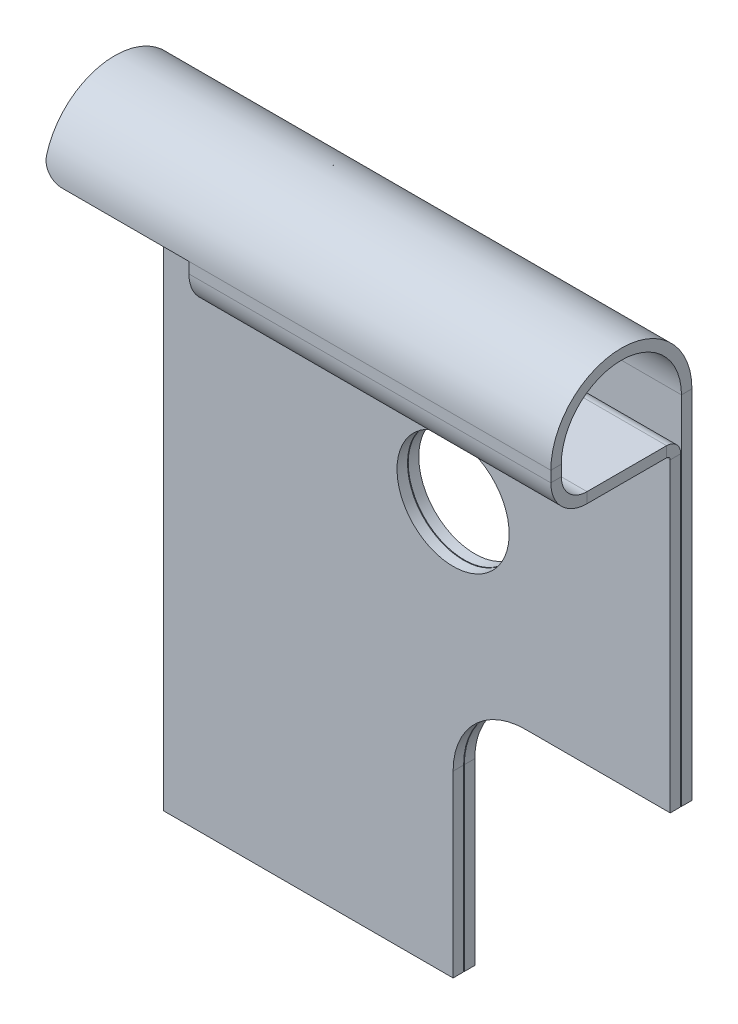
ISO-10303-21;
HEADER;
FILE_DESCRIPTION(('STEP AP214'),'2;1');
FILE_NAME('part.step','',(''),(''),'','','');
FILE_SCHEMA(('AUTOMOTIVE_DESIGN { 1 0 10303 214 1 1 1 1 }'));
ENDSEC;
DATA;
#1=APPLICATION_CONTEXT('core data for automotive mechanical design processes');
#2=APPLICATION_PROTOCOL_DEFINITION('international standard','automotive_design',2000,#1);
#3=PRODUCT_CONTEXT('',#1,'mechanical');
#4=PRODUCT('Part','Part','',(#3));
#5=PRODUCT_RELATED_PRODUCT_CATEGORY('part','',(#4));
#6=PRODUCT_DEFINITION_FORMATION('','',#4);
#7=PRODUCT_DEFINITION_CONTEXT('part definition',#1,'design');
#8=PRODUCT_DEFINITION('design','',#6,#7);
#9=PRODUCT_DEFINITION_SHAPE('','',#8);
#10=(LENGTH_UNIT() NAMED_UNIT(*) SI_UNIT(.MILLI.,.METRE.));
#11=(NAMED_UNIT(*) PLANE_ANGLE_UNIT() SI_UNIT($,.RADIAN.));
#12=(NAMED_UNIT(*) SI_UNIT($,.STERADIAN.) SOLID_ANGLE_UNIT());
#13=UNCERTAINTY_MEASURE_WITH_UNIT(LENGTH_MEASURE(1.E-05),#10,'distance_accuracy_value','');
#14=(GEOMETRIC_REPRESENTATION_CONTEXT(3) GLOBAL_UNCERTAINTY_ASSIGNED_CONTEXT((#13)) GLOBAL_UNIT_ASSIGNED_CONTEXT((#10,
#11,#12)) REPRESENTATION_CONTEXT('',''));
#15=CARTESIAN_POINT('',(0.,0.,0.));
#16=DIRECTION('',(0.,0.,1.));
#17=DIRECTION('',(1.,0.,0.));
#18=AXIS2_PLACEMENT_3D('',#15,#16,#17);
#19=CARTESIAN_POINT('',(14.,-1.4,-1.25));
#20=DIRECTION('',(-1.,0.,0.));
#21=DIRECTION('',(0.,0.,-1.));
#22=AXIS2_PLACEMENT_3D('',#19,#20,#21);
#23=CYLINDRICAL_SURFACE('',#22,0.39);
#24=CARTESIAN_POINT('',(4.,-1.4,-1.25));
#25=DIRECTION('',(-1.,0.,0.));
#26=DIRECTION('',(0.,0.,1.));
#27=AXIS2_PLACEMENT_3D('',#24,#25,#26);
#28=CIRCLE('',#27,0.39);
#29=CARTESIAN_POINT('',(4.,-1.4,-1.64));
#30=VERTEX_POINT('',#29);
#31=CARTESIAN_POINT('',(4.,-1.01,-1.25));
#32=VERTEX_POINT('',#31);
#33=EDGE_CURVE('E269',#30,#32,#28,.F.);
#34=ORIENTED_EDGE('',*,*,#33,.T.);
#35=DIRECTION('',(-1.,0.,0.));
#36=VECTOR('',#35,1.);
#37=CARTESIAN_POINT('',(14.,-1.01,-1.25));
#38=LINE('',#37,#36);
#39=CARTESIAN_POINT('',(14.,-1.01,-1.25));
#40=VERTEX_POINT('',#39);
#41=EDGE_CURVE('E346',#40,#32,#38,.T.);
#42=ORIENTED_EDGE('',*,*,#41,.F.);
#43=CARTESIAN_POINT('',(14.,-1.4,-1.25));
#44=DIRECTION('',(-1.,0.,0.));
#45=DIRECTION('',(0.,0.,1.));
#46=AXIS2_PLACEMENT_3D('',#43,#44,#45);
#47=CIRCLE('',#46,0.39);
#48=CARTESIAN_POINT('',(14.,-1.4,-1.64));
#49=VERTEX_POINT('',#48);
#50=EDGE_CURVE('E370',#49,#40,#47,.F.);
#51=ORIENTED_EDGE('',*,*,#50,.F.);
#52=DIRECTION('',(-1.,0.,0.));
#53=VECTOR('',#52,1.);
#54=CARTESIAN_POINT('',(14.,-1.4,-1.64));
#55=LINE('',#54,#53);
#56=EDGE_CURVE('E367',#49,#30,#55,.T.);
#57=ORIENTED_EDGE('',*,*,#56,.T.);
#58=EDGE_LOOP('',(#34,#42,#51,#57));
#59=FACE_BOUND('',#58,.T.);
#60=ADVANCED_FACE('F39',(#59),#23,.T.);
#61=CARTESIAN_POINT('',(14.,-1.4,-1.25));
#62=DIRECTION('',(-1.,0.,0.));
#63=DIRECTION('',(0.,0.,-1.));
#64=AXIS2_PLACEMENT_3D('',#61,#62,#63);
#65=CYLINDRICAL_SURFACE('',#64,0.1);
#66=DIRECTION('',(1.,0.,0.));
#67=VECTOR('',#66,1.);
#68=CARTESIAN_POINT('',(14.,-1.4,-1.35));
#69=LINE('',#68,#67);
#70=CARTESIAN_POINT('',(14.,-1.4,-1.35));
#71=VERTEX_POINT('',#70);
#72=CARTESIAN_POINT('',(4.,-1.4,-1.35));
#73=VERTEX_POINT('',#72);
#74=EDGE_CURVE('E374',#71,#73,#69,.F.);
#75=ORIENTED_EDGE('',*,*,#74,.F.);
#76=CARTESIAN_POINT('',(14.,-1.4,-1.25));
#77=DIRECTION('',(1.,0.,0.));
#78=DIRECTION('',(0.,0.,-1.));
#79=AXIS2_PLACEMENT_3D('',#76,#77,#78);
#80=CIRCLE('',#79,0.1);
#81=CARTESIAN_POINT('',(14.,-1.3,-1.25));
#82=VERTEX_POINT('',#81);
#83=EDGE_CURVE('E324',#71,#82,#80,.T.);
#84=ORIENTED_EDGE('',*,*,#83,.T.);
#85=DIRECTION('',(-1.,0.,0.));
#86=VECTOR('',#85,1.);
#87=CARTESIAN_POINT('',(14.,-1.3,-1.25));
#88=LINE('',#87,#86);
#89=CARTESIAN_POINT('',(4.,-1.3,-1.25));
#90=VERTEX_POINT('',#89);
#91=EDGE_CURVE('E378',#82,#90,#88,.T.);
#92=ORIENTED_EDGE('',*,*,#91,.T.);
#93=CARTESIAN_POINT('',(4.,-1.4,-1.25));
#94=DIRECTION('',(1.,0.,0.));
#95=DIRECTION('',(0.,0.,-1.));
#96=AXIS2_PLACEMENT_3D('',#93,#94,#95);
#97=CIRCLE('',#96,0.1);
#98=EDGE_CURVE('E270',#73,#90,#97,.T.);
#99=ORIENTED_EDGE('',*,*,#98,.F.);
#100=EDGE_LOOP('',(#75,#84,#92,#99));
#101=FACE_BOUND('',#100,.T.);
#102=ADVANCED_FACE('F471',(#101),#65,.F.);
#103=CARTESIAN_POINT('',(14.,-0.3,0.950000000000001));
#104=DIRECTION('',(-1.,0.,0.));
#105=DIRECTION('',(0.,0.,-1.));
#106=AXIS2_PLACEMENT_3D('',#103,#104,#105);
#107=CYLINDRICAL_SURFACE('',#106,0.71);
#108=DIRECTION('',(-1.,0.,0.));
#109=VECTOR('',#108,1.);
#110=CARTESIAN_POINT('',(14.,-0.3,1.66));
#111=LINE('',#110,#109);
#112=CARTESIAN_POINT('',(14.,-0.3,1.66));
#113=VERTEX_POINT('',#112);
#114=CARTESIAN_POINT('',(4.,-0.3,1.66));
#115=VERTEX_POINT('',#114);
#116=EDGE_CURVE('E320',#113,#115,#111,.T.);
#117=ORIENTED_EDGE('',*,*,#116,.F.);
#118=CARTESIAN_POINT('',(14.,-0.3,0.950000000000001));
#119=DIRECTION('',(-1.,0.,0.));
#120=DIRECTION('',(0.,0.,1.));
#121=AXIS2_PLACEMENT_3D('',#118,#119,#120);
#122=CIRCLE('',#121,0.71);
#123=CARTESIAN_POINT('',(14.,-1.01,0.950000000000001));
#124=VERTEX_POINT('',#123);
#125=EDGE_CURVE('E355',#124,#113,#122,.T.);
#126=ORIENTED_EDGE('',*,*,#125,.F.);
#127=DIRECTION('',(-1.,0.,0.));
#128=VECTOR('',#127,1.);
#129=CARTESIAN_POINT('',(14.,-1.01,0.950000000000001));
#130=LINE('',#129,#128);
#131=CARTESIAN_POINT('',(4.,-1.01,0.95));
#132=VERTEX_POINT('',#131);
#133=EDGE_CURVE('E352',#124,#132,#130,.T.);
#134=ORIENTED_EDGE('',*,*,#133,.T.);
#135=CARTESIAN_POINT('',(4.,-0.3,0.950000000000001));
#136=DIRECTION('',(1.,0.,0.));
#137=DIRECTION('',(0.,0.,-1.));
#138=AXIS2_PLACEMENT_3D('',#135,#136,#137);
#139=CIRCLE('',#138,0.71);
#140=EDGE_CURVE('E276',#132,#115,#139,.F.);
#141=ORIENTED_EDGE('',*,*,#140,.T.);
#142=EDGE_LOOP('',(#117,#126,#134,#141));
#143=FACE_BOUND('',#142,.T.);
#144=ADVANCED_FACE('F467',(#143),#107,.F.);
#145=CARTESIAN_POINT('',(14.,-1.01,-1.25));
#146=DIRECTION('',(0.,1.,0.));
#147=DIRECTION('',(0.,0.,-1.));
#148=AXIS2_PLACEMENT_3D('',#145,#146,#147);
#149=PLANE('',#148);
#150=ORIENTED_EDGE('',*,*,#133,.F.);
#151=DIRECTION('',(0.,0.,1.));
#152=VECTOR('',#151,1.);
#153=CARTESIAN_POINT('',(14.,-1.01,-1.25));
#154=LINE('',#153,#152);
#155=EDGE_CURVE('E349',#40,#124,#154,.T.);
#156=ORIENTED_EDGE('',*,*,#155,.F.);
#157=ORIENTED_EDGE('',*,*,#41,.T.);
#158=DIRECTION('',(0.,0.,-1.));
#159=VECTOR('',#158,1.);
#160=CARTESIAN_POINT('',(4.,-1.01,-1.25));
#161=LINE('',#160,#159);
#162=EDGE_CURVE('E298',#132,#32,#161,.T.);
#163=ORIENTED_EDGE('',*,*,#162,.F.);
#164=EDGE_LOOP('',(#150,#156,#157,#163));
#165=FACE_BOUND('',#164,.T.);
#166=ADVANCED_FACE('F463',(#165),#149,.T.);
#167=CARTESIAN_POINT('',(14.,0.,1.66));
#168=DIRECTION('',(0.,0.,-1.));
#169=DIRECTION('',(0.,-1.,0.));
#170=AXIS2_PLACEMENT_3D('',#167,#168,#169);
#171=PLANE('',#170);
#172=DIRECTION('',(-1.,0.,0.));
#173=VECTOR('',#172,1.);
#174=CARTESIAN_POINT('',(14.,0.,1.66));
#175=LINE('',#174,#173);
#176=CARTESIAN_POINT('',(14.,0.,1.66));
#177=VERTEX_POINT('',#176);
#178=CARTESIAN_POINT('',(4.,0.,1.66));
#179=VERTEX_POINT('',#178);
#180=EDGE_CURVE('E327',#177,#179,#175,.T.);
#181=ORIENTED_EDGE('',*,*,#180,.F.);
#182=DIRECTION('',(0.,1.,0.));
#183=VECTOR('',#182,1.);
#184=CARTESIAN_POINT('',(14.,0.,1.66));
#185=LINE('',#184,#183);
#186=EDGE_CURVE('E323',#113,#177,#185,.T.);
#187=ORIENTED_EDGE('',*,*,#186,.F.);
#188=ORIENTED_EDGE('',*,*,#116,.T.);
#189=DIRECTION('',(0.,-1.,0.));
#190=VECTOR('',#189,1.);
#191=CARTESIAN_POINT('',(4.,0.,1.66));
#192=LINE('',#191,#190);
#193=EDGE_CURVE('E282',#179,#115,#192,.T.);
#194=ORIENTED_EDGE('',*,*,#193,.F.);
#195=EDGE_LOOP('',(#181,#187,#188,#194));
#196=FACE_BOUND('',#195,.T.);
#197=ADVANCED_FACE('F466',(#196),#171,.T.);
#198=CARTESIAN_POINT('',(14.,-0.3,0.950000000000001));
#199=DIRECTION('',(-1.,0.,0.));
#200=DIRECTION('',(0.,0.,-1.));
#201=AXIS2_PLACEMENT_3D('',#198,#199,#200);
#202=CYLINDRICAL_SURFACE('',#201,1.);
#203=CARTESIAN_POINT('',(4.,-0.3,0.950000000000001));
#204=DIRECTION('',(-1.,0.,0.));
#205=DIRECTION('',(0.,0.,1.));
#206=AXIS2_PLACEMENT_3D('',#203,#204,#205);
#207=CIRCLE('',#206,1.);
#208=CARTESIAN_POINT('',(4.,-1.3,0.95));
#209=VERTEX_POINT('',#208);
#210=CARTESIAN_POINT('',(4.,-0.3,1.95));
#211=VERTEX_POINT('',#210);
#212=EDGE_CURVE('E273',#209,#211,#207,.T.);
#213=ORIENTED_EDGE('',*,*,#212,.F.);
#214=DIRECTION('',(1.,0.,0.));
#215=VECTOR('',#214,1.);
#216=CARTESIAN_POINT('',(14.,-1.3,0.950000000000001));
#217=LINE('',#216,#215);
#218=CARTESIAN_POINT('',(14.,-1.3,0.950000000000001));
#219=VERTEX_POINT('',#218);
#220=EDGE_CURVE('E383',#219,#209,#217,.F.);
#221=ORIENTED_EDGE('',*,*,#220,.F.);
#222=CARTESIAN_POINT('',(14.,-0.3,0.950000000000001));
#223=DIRECTION('',(1.,0.,0.));
#224=DIRECTION('',(0.,0.,-1.));
#225=AXIS2_PLACEMENT_3D('',#222,#223,#224);
#226=CIRCLE('',#225,1.);
#227=CARTESIAN_POINT('',(14.,-0.3,1.95));
#228=VERTEX_POINT('',#227);
#229=EDGE_CURVE('E386',#219,#228,#226,.F.);
#230=ORIENTED_EDGE('',*,*,#229,.T.);
#231=DIRECTION('',(-1.,0.,0.));
#232=VECTOR('',#231,1.);
#233=CARTESIAN_POINT('',(14.,-0.3,1.95));
#234=LINE('',#233,#232);
#235=EDGE_CURVE('E319',#228,#211,#234,.T.);
#236=ORIENTED_EDGE('',*,*,#235,.T.);
#237=EDGE_LOOP('',(#213,#221,#230,#236));
#238=FACE_BOUND('',#237,.T.);
#239=ADVANCED_FACE('F488',(#238),#202,.T.);
#240=CARTESIAN_POINT('',(14.,-1.3,-1.25));
#241=DIRECTION('',(0.,1.,0.));
#242=DIRECTION('',(0.,0.,-1.));
#243=AXIS2_PLACEMENT_3D('',#240,#241,#242);
#244=PLANE('',#243);
#245=DIRECTION('',(0.,0.,-1.));
#246=VECTOR('',#245,1.);
#247=CARTESIAN_POINT('',(4.,-1.3,-1.35));
#248=LINE('',#247,#246);
#249=EDGE_CURVE('E296',#209,#90,#248,.T.);
#250=ORIENTED_EDGE('',*,*,#249,.T.);
#251=ORIENTED_EDGE('',*,*,#91,.F.);
#252=DIRECTION('',(0.,0.,-1.));
#253=VECTOR('',#252,1.);
#254=CARTESIAN_POINT('',(14.,-1.3,-1.25));
#255=LINE('',#254,#253);
#256=EDGE_CURVE('E381',#82,#219,#255,.F.);
#257=ORIENTED_EDGE('',*,*,#256,.T.);
#258=ORIENTED_EDGE('',*,*,#220,.T.);
#259=EDGE_LOOP('',(#250,#251,#257,#258));
#260=FACE_BOUND('',#259,.T.);
#261=ADVANCED_FACE('F491',(#260),#244,.F.);
#262=CARTESIAN_POINT('',(14.,0.,1.95));
#263=DIRECTION('',(0.,0.,-1.));
#264=DIRECTION('',(0.,-1.,0.));
#265=AXIS2_PLACEMENT_3D('',#262,#263,#264);
#266=PLANE('',#265);
#267=DIRECTION('',(0.,-1.,0.));
#268=VECTOR('',#267,1.);
#269=CARTESIAN_POINT('',(4.,0.,1.95));
#270=LINE('',#269,#268);
#271=CARTESIAN_POINT('',(4.,0.,1.95));
#272=VERTEX_POINT('',#271);
#273=EDGE_CURVE('E279',#272,#211,#270,.T.);
#274=ORIENTED_EDGE('',*,*,#273,.T.);
#275=ORIENTED_EDGE('',*,*,#235,.F.);
#276=DIRECTION('',(0.,-1.,0.));
#277=VECTOR('',#276,1.);
#278=CARTESIAN_POINT('',(14.,0.,1.95));
#279=LINE('',#278,#277);
#280=CARTESIAN_POINT('',(14.,0.,1.95));
#281=VERTEX_POINT('',#280);
#282=EDGE_CURVE('E389',#228,#281,#279,.F.);
#283=ORIENTED_EDGE('',*,*,#282,.T.);
#284=DIRECTION('',(1.,0.,0.));
#285=VECTOR('',#284,1.);
#286=CARTESIAN_POINT('',(14.,0.,1.95));
#287=LINE('',#286,#285);
#288=EDGE_CURVE('E390',#281,#272,#287,.F.);
#289=ORIENTED_EDGE('',*,*,#288,.T.);
#290=EDGE_LOOP('',(#274,#275,#283,#289));
#291=FACE_BOUND('',#290,.T.);
#292=ADVANCED_FACE('F494',(#291),#266,.F.);
#293=CARTESIAN_POINT('',(14.,-16.8,-1.64));
#294=DIRECTION('',(0.,1.,0.));
#295=DIRECTION('',(-1.,0.,0.));
#296=AXIS2_PLACEMENT_3D('',#293,#294,#295);
#297=PLANE('',#296);
#298=DIRECTION('',(0.,0.,-1.));
#299=VECTOR('',#298,1.);
#300=CARTESIAN_POINT('',(8.,-16.8,1.95));
#301=LINE('',#300,#299);
#302=CARTESIAN_POINT('',(8.,-16.8,-1.35));
#303=VERTEX_POINT('',#302);
#304=CARTESIAN_POINT('',(8.,-16.8,-1.64));
#305=VERTEX_POINT('',#304);
#306=EDGE_CURVE('E239',#303,#305,#301,.T.);
#307=ORIENTED_EDGE('',*,*,#306,.F.);
#308=DIRECTION('',(1.,0.,0.));
#309=VECTOR('',#308,1.);
#310=CARTESIAN_POINT('',(14.,-16.8,-1.35));
#311=LINE('',#310,#309);
#312=CARTESIAN_POINT('',(0.,-16.8,-1.35));
#313=VERTEX_POINT('',#312);
#314=EDGE_CURVE('E415',#303,#313,#311,.F.);
#315=ORIENTED_EDGE('',*,*,#314,.T.);
#316=DIRECTION('',(0.,0.,-1.));
#317=VECTOR('',#316,1.);
#318=CARTESIAN_POINT('',(0.,-16.8,-1.64));
#319=LINE('',#318,#317);
#320=CARTESIAN_POINT('',(0.,-16.8,-1.64));
#321=VERTEX_POINT('',#320);
#322=EDGE_CURVE('E440',#313,#321,#319,.T.);
#323=ORIENTED_EDGE('',*,*,#322,.T.);
#324=DIRECTION('',(-1.,0.,0.));
#325=VECTOR('',#324,1.);
#326=CARTESIAN_POINT('',(14.,-16.8,-1.64));
#327=LINE('',#326,#325);
#328=EDGE_CURVE('E361',#305,#321,#327,.T.);
#329=ORIENTED_EDGE('',*,*,#328,.F.);
#330=EDGE_LOOP('',(#307,#315,#323,#329));
#331=FACE_BOUND('',#330,.T.);
#332=ADVANCED_FACE('F506',(#331),#297,.F.);
#333=CARTESIAN_POINT('',(14.,-16.8,-1.64));
#334=DIRECTION('',(1.,0.,0.));
#335=DIRECTION('',(0.,1.,0.));
#336=AXIS2_PLACEMENT_3D('',#333,#334,#335);
#337=PLANE('',#336);
#338=DIRECTION('',(0.,0.,-1.));
#339=VECTOR('',#338,1.);
#340=CARTESIAN_POINT('',(14.,-9.84999999999999,1.95));
#341=LINE('',#340,#339);
#342=CARTESIAN_POINT('',(14.,-9.84999999999999,-1.35));
#343=VERTEX_POINT('',#342);
#344=CARTESIAN_POINT('',(14.,-9.84999999999999,-1.64));
#345=VERTEX_POINT('',#344);
#346=EDGE_CURVE('E217',#343,#345,#341,.T.);
#347=ORIENTED_EDGE('',*,*,#346,.T.);
#348=DIRECTION('',(0.,1.,0.));
#349=VECTOR('',#348,1.);
#350=CARTESIAN_POINT('',(14.,-16.8,-1.64));
#351=LINE('',#350,#349);
#352=EDGE_CURVE('E364',#345,#49,#351,.T.);
#353=ORIENTED_EDGE('',*,*,#352,.T.);
#354=DIRECTION('',(0.,0.,-1.));
#355=VECTOR('',#354,1.);
#356=CARTESIAN_POINT('',(14.,-1.4,-1.64));
#357=LINE('',#356,#355);
#358=EDGE_CURVE('E438',#71,#49,#357,.T.);
#359=ORIENTED_EDGE('',*,*,#358,.F.);
#360=DIRECTION('',(0.,-1.,0.));
#361=VECTOR('',#360,1.);
#362=CARTESIAN_POINT('',(14.,-16.8,-1.35));
#363=LINE('',#362,#361);
#364=EDGE_CURVE('E377',#343,#71,#363,.F.);
#365=ORIENTED_EDGE('',*,*,#364,.F.);
#366=EDGE_LOOP('',(#347,#353,#359,#365));
#367=FACE_BOUND('',#366,.T.);
#368=ADVANCED_FACE('F543',(#367),#337,.T.);
#369=CARTESIAN_POINT('',(14.,-1.4,-1.25));
#370=DIRECTION('',(-1.,0.,0.));
#371=DIRECTION('',(0.,0.,-1.));
#372=AXIS2_PLACEMENT_3D('',#369,#370,#371);
#373=PLANE('',#372);
#374=ORIENTED_EDGE('',*,*,#358,.T.);
#375=ORIENTED_EDGE('',*,*,#50,.T.);
#376=DIRECTION('',(0.,1.,0.));
#377=VECTOR('',#376,1.);
#378=CARTESIAN_POINT('',(14.,-1.01,-1.25));
#379=LINE('',#378,#377);
#380=EDGE_CURVE('E436',#82,#40,#379,.T.);
#381=ORIENTED_EDGE('',*,*,#380,.F.);
#382=ORIENTED_EDGE('',*,*,#83,.F.);
#383=EDGE_LOOP('',(#374,#375,#381,#382));
#384=FACE_BOUND('',#383,.T.);
#385=ADVANCED_FACE('F539',(#384),#373,.F.);
#386=CARTESIAN_POINT('',(14.,-1.01,-1.25));
#387=DIRECTION('',(1.,0.,0.));
#388=DIRECTION('',(0.,0.,1.));
#389=AXIS2_PLACEMENT_3D('',#386,#387,#388);
#390=PLANE('',#389);
#391=ORIENTED_EDGE('',*,*,#380,.T.);
#392=ORIENTED_EDGE('',*,*,#155,.T.);
#393=DIRECTION('',(0.,1.,0.));
#394=VECTOR('',#393,1.);
#395=CARTESIAN_POINT('',(14.,-1.01,0.950000000000001));
#396=LINE('',#395,#394);
#397=EDGE_CURVE('E434',#219,#124,#396,.T.);
#398=ORIENTED_EDGE('',*,*,#397,.F.);
#399=ORIENTED_EDGE('',*,*,#256,.F.);
#400=EDGE_LOOP('',(#391,#392,#398,#399));
#401=FACE_BOUND('',#400,.T.);
#402=ADVANCED_FACE('F535',(#401),#390,.T.);
#403=CARTESIAN_POINT('',(14.,-0.3,0.950000000000001));
#404=DIRECTION('',(-1.,0.,0.));
#405=DIRECTION('',(0.,0.,-1.));
#406=AXIS2_PLACEMENT_3D('',#403,#404,#405);
#407=PLANE('',#406);
#408=ORIENTED_EDGE('',*,*,#397,.T.);
#409=ORIENTED_EDGE('',*,*,#125,.T.);
#410=DIRECTION('',(0.,0.,-1.));
#411=VECTOR('',#410,1.);
#412=CARTESIAN_POINT('',(14.,-0.3,1.66));
#413=LINE('',#412,#411);
#414=EDGE_CURVE('E432',#228,#113,#413,.T.);
#415=ORIENTED_EDGE('',*,*,#414,.F.);
#416=ORIENTED_EDGE('',*,*,#229,.F.);
#417=EDGE_LOOP('',(#408,#409,#415,#416));
#418=FACE_BOUND('',#417,.T.);
#419=ADVANCED_FACE('F531',(#418),#407,.F.);
#420=CARTESIAN_POINT('',(14.,0.,1.66));
#421=DIRECTION('',(1.,0.,0.));
#422=DIRECTION('',(0.,1.,0.));
#423=AXIS2_PLACEMENT_3D('',#420,#421,#422);
#424=PLANE('',#423);
#425=ORIENTED_EDGE('',*,*,#414,.T.);
#426=ORIENTED_EDGE('',*,*,#186,.T.);
#427=DIRECTION('',(0.,0.,-1.));
#428=VECTOR('',#427,1.);
#429=CARTESIAN_POINT('',(14.,0.,1.66));
#430=LINE('',#429,#428);
#431=EDGE_CURVE('E429',#281,#177,#430,.T.);
#432=ORIENTED_EDGE('',*,*,#431,.F.);
#433=ORIENTED_EDGE('',*,*,#282,.F.);
#434=EDGE_LOOP('',(#425,#426,#432,#433));
#435=FACE_BOUND('',#434,.T.);
#436=ADVANCED_FACE('F527',(#435),#424,.T.);
#437=CARTESIAN_POINT('',(14.,0.,0.));
#438=DIRECTION('',(-1.,0.,0.));
#439=DIRECTION('',(0.,0.,-1.));
#440=AXIS2_PLACEMENT_3D('',#437,#438,#439);
#441=PLANE('',#440);
#442=ORIENTED_EDGE('',*,*,#431,.T.);
#443=CARTESIAN_POINT('',(14.,0.,0.));
#444=DIRECTION('',(-1.,0.,0.));
#445=DIRECTION('',(0.,0.,1.));
#446=AXIS2_PLACEMENT_3D('',#443,#444,#445);
#447=CIRCLE('',#446,1.66);
#448=CARTESIAN_POINT('',(14.,0.,-1.66));
#449=VERTEX_POINT('',#448);
#450=EDGE_CURVE('E343',#177,#449,#447,.T.);
#451=ORIENTED_EDGE('',*,*,#450,.T.);
#452=DIRECTION('',(0.,0.,1.));
#453=VECTOR('',#452,1.);
#454=CARTESIAN_POINT('',(14.,0.,-1.66));
#455=LINE('',#454,#453);
#456=CARTESIAN_POINT('',(14.,0.,-1.95));
#457=VERTEX_POINT('',#456);
#458=EDGE_CURVE('E426',#457,#449,#455,.T.);
#459=ORIENTED_EDGE('',*,*,#458,.F.);
#460=CARTESIAN_POINT('',(14.,0.,0.));
#461=DIRECTION('',(1.,0.,0.));
#462=DIRECTION('',(0.,0.,-1.));
#463=AXIS2_PLACEMENT_3D('',#460,#461,#462);
#464=CIRCLE('',#463,1.95);
#465=EDGE_CURVE('E382',#281,#457,#464,.F.);
#466=ORIENTED_EDGE('',*,*,#465,.F.);
#467=EDGE_LOOP('',(#442,#451,#459,#466));
#468=FACE_BOUND('',#467,.T.);
#469=ADVANCED_FACE('F523',(#468),#441,.F.);
#470=CARTESIAN_POINT('',(14.,0.,-1.66));
#471=DIRECTION('',(-1.,0.,0.));
#472=DIRECTION('',(0.,1.,0.));
#473=AXIS2_PLACEMENT_3D('',#470,#471,#472);
#474=PLANE('',#473);
#475=CARTESIAN_POINT('',(14.,-9.84999999999999,-1.66));
#476=VERTEX_POINT('',#475);
#477=CARTESIAN_POINT('',(14.,-9.84999999999999,-1.95));
#478=VERTEX_POINT('',#477);
#479=EDGE_CURVE('E235',#476,#478,#341,.T.);
#480=ORIENTED_EDGE('',*,*,#479,.T.);
#481=DIRECTION('',(0.,1.,0.));
#482=VECTOR('',#481,1.);
#483=CARTESIAN_POINT('',(14.,0.,-1.95));
#484=LINE('',#483,#482);
#485=EDGE_CURVE('E230',#457,#478,#484,.F.);
#486=ORIENTED_EDGE('',*,*,#485,.F.);
#487=ORIENTED_EDGE('',*,*,#458,.T.);
#488=DIRECTION('',(0.,1.,0.));
#489=VECTOR('',#488,1.);
#490=CARTESIAN_POINT('',(14.,0.,-1.66));
#491=LINE('',#490,#489);
#492=EDGE_CURVE('E334',#449,#476,#491,.F.);
#493=ORIENTED_EDGE('',*,*,#492,.T.);
#494=EDGE_LOOP('',(#480,#486,#487,#493));
#495=FACE_BOUND('',#494,.T.);
#496=ADVANCED_FACE('F519',(#495),#474,.F.);
#497=CARTESIAN_POINT('',(14.,-16.8,-1.66));
#498=DIRECTION('',(0.,-1.,0.));
#499=DIRECTION('',(-1.,0.,0.));
#500=AXIS2_PLACEMENT_3D('',#497,#498,#499);
#501=PLANE('',#500);
#502=CARTESIAN_POINT('',(8.,-16.8,-1.66));
#503=VERTEX_POINT('',#502);
#504=CARTESIAN_POINT('',(8.,-16.8,-1.95));
#505=VERTEX_POINT('',#504);
#506=EDGE_CURVE('E236',#503,#505,#301,.T.);
#507=ORIENTED_EDGE('',*,*,#506,.F.);
#508=DIRECTION('',(-1.,0.,0.));
#509=VECTOR('',#508,1.);
#510=CARTESIAN_POINT('',(14.,-16.8,-1.66));
#511=LINE('',#510,#509);
#512=CARTESIAN_POINT('',(0.,-16.8,-1.66));
#513=VERTEX_POINT('',#512);
#514=EDGE_CURVE('E337',#503,#513,#511,.T.);
#515=ORIENTED_EDGE('',*,*,#514,.T.);
#516=DIRECTION('',(0.,0.,1.));
#517=VECTOR('',#516,1.);
#518=CARTESIAN_POINT('',(0.,-16.8,-1.66));
#519=LINE('',#518,#517);
#520=CARTESIAN_POINT('',(0.,-16.8,-1.95));
#521=VERTEX_POINT('',#520);
#522=EDGE_CURVE('E423',#521,#513,#519,.T.);
#523=ORIENTED_EDGE('',*,*,#522,.F.);
#524=DIRECTION('',(-1.,0.,0.));
#525=VECTOR('',#524,1.);
#526=CARTESIAN_POINT('',(14.,-16.8,-1.95));
#527=LINE('',#526,#525);
#528=EDGE_CURVE('E399',#505,#521,#527,.T.);
#529=ORIENTED_EDGE('',*,*,#528,.F.);
#530=EDGE_LOOP('',(#507,#515,#523,#529));
#531=FACE_BOUND('',#530,.T.);
#532=ADVANCED_FACE('F515',(#531),#501,.T.);
#533=CARTESIAN_POINT('',(0.,0.,-1.66));
#534=DIRECTION('',(-1.,0.,0.));
#535=DIRECTION('',(0.,1.,0.));
#536=AXIS2_PLACEMENT_3D('',#533,#534,#535);
#537=PLANE('',#536);
#538=ORIENTED_EDGE('',*,*,#522,.T.);
#539=DIRECTION('',(0.,1.,0.));
#540=VECTOR('',#539,1.);
#541=CARTESIAN_POINT('',(0.,0.,-1.66));
#542=LINE('',#541,#540);
#543=CARTESIAN_POINT('',(0.,0.,-1.66));
#544=VERTEX_POINT('',#543);
#545=EDGE_CURVE('E330',#544,#513,#542,.F.);
#546=ORIENTED_EDGE('',*,*,#545,.F.);
#547=DIRECTION('',(0.,0.,1.));
#548=VECTOR('',#547,1.);
#549=CARTESIAN_POINT('',(0.,0.,-1.66));
#550=LINE('',#549,#548);
#551=CARTESIAN_POINT('',(0.,0.,-1.95));
#552=VERTEX_POINT('',#551);
#553=EDGE_CURVE('E420',#552,#544,#550,.T.);
#554=ORIENTED_EDGE('',*,*,#553,.F.);
#555=DIRECTION('',(0.,1.,0.));
#556=VECTOR('',#555,1.);
#557=CARTESIAN_POINT('',(0.,0.,-1.95));
#558=LINE('',#557,#556);
#559=EDGE_CURVE('E393',#552,#521,#558,.F.);
#560=ORIENTED_EDGE('',*,*,#559,.T.);
#561=EDGE_LOOP('',(#538,#546,#554,#560));
#562=FACE_BOUND('',#561,.T.);
#563=ADVANCED_FACE('F511',(#562),#537,.T.);
#564=CARTESIAN_POINT('',(0.,0.,0.));
#565=DIRECTION('',(-1.,0.,0.));
#566=DIRECTION('',(0.,0.,-1.));
#567=AXIS2_PLACEMENT_3D('',#564,#565,#566);
#568=PLANE('',#567);
#569=CARTESIAN_POINT('',(0.,0.,0.));
#570=DIRECTION('',(1.,0.,0.));
#571=DIRECTION('',(0.,0.,-1.));
#572=AXIS2_PLACEMENT_3D('',#569,#570,#571);
#573=CIRCLE('',#572,1.95);
#574=CARTESIAN_POINT('',(0.,0.5,1.88480768249708));
#575=VERTEX_POINT('',#574);
#576=EDGE_CURVE('E396',#575,#552,#573,.F.);
#577=ORIENTED_EDGE('',*,*,#576,.T.);
#578=ORIENTED_EDGE('',*,*,#553,.T.);
#579=CARTESIAN_POINT('',(0.,0.,0.));
#580=DIRECTION('',(-1.,0.,0.));
#581=DIRECTION('',(0.,0.,1.));
#582=AXIS2_PLACEMENT_3D('',#579,#580,#581);
#583=CIRCLE('',#582,1.66);
#584=CARTESIAN_POINT('',(0.,0.5,1.58290871499275));
#585=VERTEX_POINT('',#584);
#586=EDGE_CURVE('E340',#585,#544,#583,.T.);
#587=ORIENTED_EDGE('',*,*,#586,.F.);
#588=DIRECTION('',(0.,0.,-1.));
#589=VECTOR('',#588,1.);
#590=CARTESIAN_POINT('',(0.,0.499999999999999,0.));
#591=LINE('',#590,#589);
#592=EDGE_CURVE('E443',#575,#585,#591,.T.);
#593=ORIENTED_EDGE('',*,*,#592,.F.);
#594=EDGE_LOOP('',(#577,#578,#587,#593));
#595=FACE_BOUND('',#594,.T.);
#596=ADVANCED_FACE('F508',(#595),#568,.T.);
#597=CARTESIAN_POINT('',(0.,-16.8,-1.64));
#598=DIRECTION('',(1.,0.,0.));
#599=DIRECTION('',(0.,1.,0.));
#600=AXIS2_PLACEMENT_3D('',#597,#598,#599);
#601=PLANE('',#600);
#602=DIRECTION('',(0.,-1.,0.));
#603=VECTOR('',#602,1.);
#604=CARTESIAN_POINT('',(0.,-16.8,-1.35));
#605=LINE('',#604,#603);
#606=CARTESIAN_POINT('',(0.,-1.4,-1.35));
#607=VERTEX_POINT('',#606);
#608=EDGE_CURVE('E409',#313,#607,#605,.F.);
#609=ORIENTED_EDGE('',*,*,#608,.T.);
#610=DIRECTION('',(0.,0.,-1.));
#611=VECTOR('',#610,1.);
#612=CARTESIAN_POINT('',(0.,-1.4,-1.64));
#613=LINE('',#612,#611);
#614=CARTESIAN_POINT('',(0.,-1.4,-1.64));
#615=VERTEX_POINT('',#614);
#616=EDGE_CURVE('E373',#607,#615,#613,.T.);
#617=ORIENTED_EDGE('',*,*,#616,.T.);
#618=DIRECTION('',(0.,1.,0.));
#619=VECTOR('',#618,1.);
#620=CARTESIAN_POINT('',(0.,-16.8,-1.64));
#621=LINE('',#620,#619);
#622=EDGE_CURVE('E358',#321,#615,#621,.T.);
#623=ORIENTED_EDGE('',*,*,#622,.F.);
#624=ORIENTED_EDGE('',*,*,#322,.F.);
#625=EDGE_LOOP('',(#609,#617,#623,#624));
#626=FACE_BOUND('',#625,.T.);
#627=ADVANCED_FACE('F475',(#626),#601,.F.);
#628=CARTESIAN_POINT('',(14.,-16.8,-1.64));
#629=DIRECTION('',(0.,0.,-1.));
#630=DIRECTION('',(0.,-1.,0.));
#631=AXIS2_PLACEMENT_3D('',#628,#629,#630);
#632=PLANE('',#631);
#633=DIRECTION('',(0.,-1.,0.));
#634=VECTOR('',#633,1.);
#635=CARTESIAN_POINT('',(8.,-16.8,-1.64));
#636=LINE('',#635,#634);
#637=CARTESIAN_POINT('',(8.,-11.85,-1.64));
#638=VERTEX_POINT('',#637);
#639=EDGE_CURVE('E261',#638,#305,#636,.T.);
#640=ORIENTED_EDGE('',*,*,#639,.T.);
#641=ORIENTED_EDGE('',*,*,#328,.T.);
#642=ORIENTED_EDGE('',*,*,#622,.T.);
#643=DIRECTION('',(-1.,0.,0.));
#644=VECTOR('',#643,1.);
#645=CARTESIAN_POINT('',(14.,-1.4,-1.64));
#646=LINE('',#645,#644);
#647=EDGE_CURVE('E264',#30,#615,#646,.T.);
#648=ORIENTED_EDGE('',*,*,#647,.F.);
#649=ORIENTED_EDGE('',*,*,#56,.F.);
#650=ORIENTED_EDGE('',*,*,#352,.F.);
#651=DIRECTION('',(-1.,0.,0.));
#652=VECTOR('',#651,1.);
#653=CARTESIAN_POINT('',(14.,-9.84999999999999,-1.64));
#654=LINE('',#653,#652);
#655=CARTESIAN_POINT('',(10.,-9.84999999999999,-1.64));
#656=VERTEX_POINT('',#655);
#657=EDGE_CURVE('E246',#345,#656,#654,.T.);
#658=ORIENTED_EDGE('',*,*,#657,.T.);
#659=CARTESIAN_POINT('',(10.,-11.85,-1.64));
#660=DIRECTION('',(0.,0.,1.));
#661=DIRECTION('',(0.,-1.,0.));
#662=AXIS2_PLACEMENT_3D('',#659,#660,#661);
#663=CIRCLE('',#662,2.);
#664=EDGE_CURVE('E253',#656,#638,#663,.T.);
#665=ORIENTED_EDGE('',*,*,#664,.T.);
#666=EDGE_LOOP('',(#640,#641,#642,#648,#649,#650,#658,#665));
#667=FACE_BOUND('',#666,.T.);
#668=CARTESIAN_POINT('',(8.,-5.4,-1.64));
#669=DIRECTION('',(0.,0.,1.));
#670=DIRECTION('',(0.,-1.,0.));
#671=AXIS2_PLACEMENT_3D('',#668,#669,#670);
#672=CIRCLE('',#671,1.55);
#673=CARTESIAN_POINT('',(8.,-6.94999999999999,-1.64));
#674=VERTEX_POINT('',#673);
#675=EDGE_CURVE('E316',#674,#674,#672,.T.);
#676=ORIENTED_EDGE('',*,*,#675,.T.);
#677=EDGE_LOOP('',(#676));
#678=FACE_BOUND('',#677,.T.);
#679=ADVANCED_FACE('F460',(#667,#678),#632,.T.);
#680=CARTESIAN_POINT('',(14.,0.,0.));
#681=DIRECTION('',(-1.,0.,0.));
#682=DIRECTION('',(0.,0.,-1.));
#683=AXIS2_PLACEMENT_3D('',#680,#681,#682);
#684=CYLINDRICAL_SURFACE('',#683,1.66);
#685=ORIENTED_EDGE('',*,*,#586,.T.);
#686=DIRECTION('',(-1.,0.,0.));
#687=VECTOR('',#686,1.);
#688=CARTESIAN_POINT('',(14.,0.,-1.66));
#689=LINE('',#688,#687);
#690=EDGE_CURVE('E332',#449,#544,#689,.T.);
#691=ORIENTED_EDGE('',*,*,#690,.F.);
#692=ORIENTED_EDGE('',*,*,#450,.F.);
#693=ORIENTED_EDGE('',*,*,#180,.T.);
#694=DIRECTION('',(1.,0.,0.));
#695=VECTOR('',#694,1.);
#696=CARTESIAN_POINT('',(14.,0.,1.66));
#697=LINE('',#696,#695);
#698=CARTESIAN_POINT('',(0.5,0.,1.66));
#699=VERTEX_POINT('',#698);
#700=EDGE_CURVE('E285',#699,#179,#697,.T.);
#701=ORIENTED_EDGE('',*,*,#700,.F.);
#702=CARTESIAN_POINT('',(0.,0.5,1.58290871499275));
#703=CARTESIAN_POINT('',(-3.04874470838139E-05,0.473305683010919,1.59136884228898));
#704=CARTESIAN_POINT('',(0.00213736647421499,0.446364873766319,1.59910846703248));
#705=CARTESIAN_POINT('',(0.0108790465244126,0.392814108202417,1.6130837188091));
#706=CARTESIAN_POINT('',(0.0174526349199534,0.366204134110165,1.61931942696885));
#707=CARTESIAN_POINT('',(0.035031436991465,0.314087288301205,1.63023494367756));
#708=CARTESIAN_POINT('',(0.0460448887520152,0.288582565325867,1.63491183022934));
#709=CARTESIAN_POINT('',(0.0722589081248538,0.239599878062638,1.64280434379643));
#710=CARTESIAN_POINT('',(0.0874567499891516,0.216120607409068,1.6460209184707));
#711=CARTESIAN_POINT('',(0.121240438758877,0.172454618110652,1.65116113315822));
#712=CARTESIAN_POINT('',(0.139740440207153,0.15220465537992,1.65311277594874));
#713=CARTESIAN_POINT('',(0.179847095458068,0.114965979439494,1.6561197412087));
#714=CARTESIAN_POINT('',(0.201454888478418,0.0979784674966709,1.65717473401059));
#715=CARTESIAN_POINT('',(0.247378205839372,0.0676264774163348,1.6586924282557));
#716=CARTESIAN_POINT('',(0.271716420905202,0.0542961035548018,1.65914969480005));
#717=CARTESIAN_POINT('',(0.322260010162292,0.0318412908877489,1.65973270157584));
#718=CARTESIAN_POINT('',(0.348464696975014,0.0227153128527091,1.65985856321432));
#719=CARTESIAN_POINT('',(0.395597228912475,0.0105690128341441,1.65997491526087));
#720=CARTESIAN_POINT('',(0.416288701153844,0.00661055580262031,1.6599905773106));
#721=CARTESIAN_POINT('',(0.45798429150877,0.00132456856542991,1.65999994141239));
#722=CARTESIAN_POINT('',(0.478988084279878,-5.52929377733731E-06,1.6599936649129));
#723=CARTESIAN_POINT('',(0.5,0.,1.66));
#724=B_SPLINE_CURVE_WITH_KNOTS('',3,(#702,#703,#704,#705,#706,#707,#708,#709,#710,#711,#712,
#713,#714,#715,#716,#717,#718,#719,#720,#721,#722,#723),.UNSPECIFIED.,.F.,.F.,(4,2,2,2,2,2,2,2,
2,2,4),(0.,0.0839403815563474,0.167876234055751,0.251968550125583,0.336006216807935,
0.418113450214981,0.500250858601365,0.583130032655848,0.66597884048204,0.729018784227924,
0.79199711352061),.UNSPECIFIED.);
#725=EDGE_CURVE('E448',#585,#699,#724,.T.);
#726=ORIENTED_EDGE('',*,*,#725,.F.);
#727=EDGE_LOOP('',(#685,#691,#692,#693,#701,#726));
#728=FACE_BOUND('',#727,.T.);
#729=ADVANCED_FACE('F454',(#728),#684,.F.);
#730=CARTESIAN_POINT('',(14.,0.,-1.66));
#731=DIRECTION('',(0.,0.,1.));
#732=DIRECTION('',(-1.,0.,0.));
#733=AXIS2_PLACEMENT_3D('',#730,#731,#732);
#734=PLANE('',#733);
#735=DIRECTION('',(0.,1.,0.));
#736=VECTOR('',#735,1.);
#737=CARTESIAN_POINT('',(8.,0.,-1.66));
#738=LINE('',#737,#736);
#739=CARTESIAN_POINT('',(8.,-11.85,-1.66));
#740=VERTEX_POINT('',#739);
#741=EDGE_CURVE('E258',#503,#740,#738,.T.);
#742=ORIENTED_EDGE('',*,*,#741,.T.);
#743=CARTESIAN_POINT('',(10.,-11.85,-1.66));
#744=DIRECTION('',(0.,0.,-1.));
#745=DIRECTION('',(-1.,0.,0.));
#746=AXIS2_PLACEMENT_3D('',#743,#744,#745);
#747=CIRCLE('',#746,2.);
#748=CARTESIAN_POINT('',(10.,-9.84999999999999,-1.66));
#749=VERTEX_POINT('',#748);
#750=EDGE_CURVE('E251',#740,#749,#747,.T.);
#751=ORIENTED_EDGE('',*,*,#750,.T.);
#752=DIRECTION('',(1.,0.,0.));
#753=VECTOR('',#752,1.);
#754=CARTESIAN_POINT('',(14.,-9.84999999999999,-1.66));
#755=LINE('',#754,#753);
#756=EDGE_CURVE('E213',#749,#476,#755,.T.);
#757=ORIENTED_EDGE('',*,*,#756,.T.);
#758=ORIENTED_EDGE('',*,*,#492,.F.);
#759=ORIENTED_EDGE('',*,*,#690,.T.);
#760=ORIENTED_EDGE('',*,*,#545,.T.);
#761=ORIENTED_EDGE('',*,*,#514,.F.);
#762=EDGE_LOOP('',(#742,#751,#757,#758,#759,#760,#761));
#763=FACE_BOUND('',#762,.T.);
#764=CARTESIAN_POINT('',(8.,-5.4,-1.66));
#765=DIRECTION('',(0.,0.,-1.));
#766=DIRECTION('',(-1.,0.,0.));
#767=AXIS2_PLACEMENT_3D('',#764,#765,#766);
#768=CIRCLE('',#767,1.55);
#769=CARTESIAN_POINT('',(6.45,-5.4,-1.66));
#770=VERTEX_POINT('',#769);
#771=EDGE_CURVE('E311',#770,#770,#768,.T.);
#772=ORIENTED_EDGE('',*,*,#771,.T.);
#773=EDGE_LOOP('',(#772));
#774=FACE_BOUND('',#773,.T.);
#775=ADVANCED_FACE('F459',(#763,#774),#734,.T.);
#776=CARTESIAN_POINT('',(14.,-16.8,-1.35));
#777=DIRECTION('',(0.,0.,-1.));
#778=DIRECTION('',(0.,-1.,0.));
#779=AXIS2_PLACEMENT_3D('',#776,#777,#778);
#780=PLANE('',#779);
#781=CARTESIAN_POINT('',(8.,-5.4,-1.35));
#782=DIRECTION('',(0.,0.,-1.));
#783=DIRECTION('',(0.,1.,0.));
#784=AXIS2_PLACEMENT_3D('',#781,#782,#783);
#785=CIRCLE('',#784,1.55);
#786=CARTESIAN_POINT('',(8.,-3.84999999999999,-1.35));
#787=VERTEX_POINT('',#786);
#788=EDGE_CURVE('E306',#787,#787,#785,.T.);
#789=ORIENTED_EDGE('',*,*,#788,.T.);
#790=EDGE_LOOP('',(#789));
#791=FACE_BOUND('',#790,.T.);
#792=CARTESIAN_POINT('',(10.,-11.85,-1.35));
#793=DIRECTION('',(0.,0.,1.));
#794=DIRECTION('',(0.,-1.,0.));
#795=AXIS2_PLACEMENT_3D('',#792,#793,#794);
#796=CIRCLE('',#795,2.);
#797=CARTESIAN_POINT('',(10.,-9.84999999999999,-1.35));
#798=VERTEX_POINT('',#797);
#799=CARTESIAN_POINT('',(8.,-11.85,-1.35));
#800=VERTEX_POINT('',#799);
#801=EDGE_CURVE('E249',#798,#800,#796,.T.);
#802=ORIENTED_EDGE('',*,*,#801,.F.);
#803=DIRECTION('',(-1.,0.,0.));
#804=VECTOR('',#803,1.);
#805=CARTESIAN_POINT('',(14.,-9.84999999999999,-1.35));
#806=LINE('',#805,#804);
#807=EDGE_CURVE('E243',#343,#798,#806,.T.);
#808=ORIENTED_EDGE('',*,*,#807,.F.);
#809=ORIENTED_EDGE('',*,*,#364,.T.);
#810=ORIENTED_EDGE('',*,*,#74,.T.);
#811=DIRECTION('',(1.,0.,0.));
#812=VECTOR('',#811,1.);
#813=CARTESIAN_POINT('',(14.,-1.4,-1.35));
#814=LINE('',#813,#812);
#815=EDGE_CURVE('E263',#73,#607,#814,.F.);
#816=ORIENTED_EDGE('',*,*,#815,.T.);
#817=ORIENTED_EDGE('',*,*,#608,.F.);
#818=ORIENTED_EDGE('',*,*,#314,.F.);
#819=DIRECTION('',(0.,-1.,0.));
#820=VECTOR('',#819,1.);
#821=CARTESIAN_POINT('',(8.,-16.8,-1.35));
#822=LINE('',#821,#820);
#823=EDGE_CURVE('E256',#800,#303,#822,.T.);
#824=ORIENTED_EDGE('',*,*,#823,.F.);
#825=EDGE_LOOP('',(#802,#808,#809,#810,#816,#817,#818,#824));
#826=FACE_BOUND('',#825,.T.);
#827=ADVANCED_FACE('F483',(#791,#826),#780,.F.);
#828=CARTESIAN_POINT('',(14.,0.,0.));
#829=DIRECTION('',(-1.,0.,0.));
#830=DIRECTION('',(0.,0.,-1.));
#831=AXIS2_PLACEMENT_3D('',#828,#829,#830);
#832=CYLINDRICAL_SURFACE('',#831,1.95);
#833=DIRECTION('',(1.,0.,0.));
#834=VECTOR('',#833,1.);
#835=CARTESIAN_POINT('',(4.,0.,1.95));
#836=LINE('',#835,#834);
#837=CARTESIAN_POINT('',(0.5,0.,1.95));
#838=VERTEX_POINT('',#837);
#839=EDGE_CURVE('E286',#838,#272,#836,.T.);
#840=ORIENTED_EDGE('',*,*,#839,.T.);
#841=ORIENTED_EDGE('',*,*,#288,.F.);
#842=ORIENTED_EDGE('',*,*,#465,.T.);
#843=DIRECTION('',(-1.,0.,0.));
#844=VECTOR('',#843,1.);
#845=CARTESIAN_POINT('',(14.,0.,-1.95));
#846=LINE('',#845,#844);
#847=EDGE_CURVE('E394',#457,#552,#846,.T.);
#848=ORIENTED_EDGE('',*,*,#847,.T.);
#849=ORIENTED_EDGE('',*,*,#576,.F.);
#850=CARTESIAN_POINT('',(0.5,0.,1.95));
#851=CARTESIAN_POINT('',(0.471889234641696,-2.3867831199494E-05,1.94998270105598));
#852=CARTESIAN_POINT('',(0.443785409309113,0.00236922469888775,1.94999970876098));
#853=CARTESIAN_POINT('',(0.388390087532732,0.011813882992875,1.9499744982827));
#854=CARTESIAN_POINT('',(0.361098060374306,0.018862332101112,1.94993231970208));
#855=CARTESIAN_POINT('',(0.308071409174362,0.0374474845844344,1.94966114614452));
#856=CARTESIAN_POINT('',(0.282337596694851,0.0489865039305749,1.94943205470201));
#857=CARTESIAN_POINT('',(0.233179385462002,0.0762128298510363,1.94855782990784));
#858=CARTESIAN_POINT('',(0.209754601206977,0.0918994423519263,1.94791276614055));
#859=CARTESIAN_POINT('',(0.165944827141076,0.126916327290599,1.94594389125882));
#860=CARTESIAN_POINT('',(0.145551665039638,0.146236473839045,1.94462194923541));
#861=CARTESIAN_POINT('',(0.108316713775407,0.187965055215522,1.94103235064023));
#862=CARTESIAN_POINT('',(0.0914746533384823,0.210373253926077,1.93876476634697));
#863=CARTESIAN_POINT('',(0.0619808079128891,0.257308762872181,1.93309184466652));
#864=CARTESIAN_POINT('',(0.0492841319858386,0.281809478310875,1.92969955716799));
#865=CARTESIAN_POINT('',(0.0281360320679472,0.33238429224526,1.92163346087647));
#866=CARTESIAN_POINT('',(0.0196840186042376,0.35845817170585,1.91695983016807));
#867=CARTESIAN_POINT('',(0.0089335759717866,0.403898631088686,1.90781069946382));
#868=CARTESIAN_POINT('',(0.00557245995030945,0.423085964447205,1.90365014039306));
#869=CARTESIAN_POINT('',(0.00110524723615944,0.461541503012649,1.89469610887022));
#870=CARTESIAN_POINT('',(-4.61622163173962E-06,0.48080951898901,1.88990370794362));
#871=CARTESIAN_POINT('',(0.,0.5,1.88480768249708));
#872=B_SPLINE_CURVE_WITH_KNOTS('',3,(#850,#851,#852,#853,#854,#855,#856,#857,#858,#859,#860,
#861,#862,#863,#864,#865,#866,#867,#868,#869,#870,#871),.UNSPECIFIED.,.F.,.F.,(4,2,2,2,2,2,2,2,
2,2,4),(0.,0.0842207438021217,0.168385160800607,0.252593042485713,0.336786841424422,
0.42074939647167,0.504705535164182,0.587719768169438,0.670722469473501,0.730347438339198,
0.78987256095193),.UNSPECIFIED.);
#873=EDGE_CURVE('E11',#838,#575,#872,.T.);
#874=ORIENTED_EDGE('',*,*,#873,.F.);
#875=EDGE_LOOP('',(#840,#841,#842,#848,#849,#874));
#876=FACE_BOUND('',#875,.T.);
#877=ADVANCED_FACE('F486',(#876),#832,.T.);
#878=CARTESIAN_POINT('',(14.,0.,-1.95));
#879=DIRECTION('',(0.,0.,1.));
#880=DIRECTION('',(-1.,0.,0.));
#881=AXIS2_PLACEMENT_3D('',#878,#879,#880);
#882=PLANE('',#881);
#883=CARTESIAN_POINT('',(8.,-5.4,-1.95));
#884=DIRECTION('',(0.,0.,-1.));
#885=DIRECTION('',(0.,1.,0.));
#886=AXIS2_PLACEMENT_3D('',#883,#884,#885);
#887=CIRCLE('',#886,1.55);
#888=CARTESIAN_POINT('',(8.,-3.84999999999999,-1.95));
#889=VERTEX_POINT('',#888);
#890=EDGE_CURVE('E308',#889,#889,#887,.T.);
#891=ORIENTED_EDGE('',*,*,#890,.F.);
#892=EDGE_LOOP('',(#891));
#893=FACE_BOUND('',#892,.T.);
#894=ORIENTED_EDGE('',*,*,#528,.T.);
#895=ORIENTED_EDGE('',*,*,#559,.F.);
#896=ORIENTED_EDGE('',*,*,#847,.F.);
#897=ORIENTED_EDGE('',*,*,#485,.T.);
#898=DIRECTION('',(-1.,0.,0.));
#899=VECTOR('',#898,1.);
#900=CARTESIAN_POINT('',(10.,-9.84999999999999,-1.95));
#901=LINE('',#900,#899);
#902=CARTESIAN_POINT('',(10.,-9.84999999999999,-1.95));
#903=VERTEX_POINT('',#902);
#904=EDGE_CURVE('E67',#478,#903,#901,.T.);
#905=ORIENTED_EDGE('',*,*,#904,.T.);
#906=CARTESIAN_POINT('',(10.,-11.85,-1.95));
#907=DIRECTION('',(0.,0.,1.));
#908=DIRECTION('',(-1.,0.,0.));
#909=AXIS2_PLACEMENT_3D('',#906,#907,#908);
#910=CIRCLE('',#909,2.);
#911=CARTESIAN_POINT('',(8.,-11.85,-1.95));
#912=VERTEX_POINT('',#911);
#913=EDGE_CURVE('E220',#903,#912,#910,.T.);
#914=ORIENTED_EDGE('',*,*,#913,.T.);
#915=DIRECTION('',(0.,-1.,0.));
#916=VECTOR('',#915,1.);
#917=CARTESIAN_POINT('',(8.,-16.8,-1.95));
#918=LINE('',#917,#916);
#919=EDGE_CURVE('E225',#912,#505,#918,.T.);
#920=ORIENTED_EDGE('',*,*,#919,.T.);
#921=EDGE_LOOP('',(#894,#895,#896,#897,#905,#914,#920));
#922=FACE_BOUND('',#921,.T.);
#923=ADVANCED_FACE('F228',(#893,#922),#882,.F.);
#924=CARTESIAN_POINT('',(8.,-5.4,-1.95));
#925=DIRECTION('',(0.,0.,1.));
#926=DIRECTION('',(0.,1.,0.));
#927=AXIS2_PLACEMENT_3D('',#924,#925,#926);
#928=CYLINDRICAL_SURFACE('',#927,1.55);
#929=ORIENTED_EDGE('',*,*,#771,.F.);
#930=EDGE_LOOP('',(#929));
#931=FACE_BOUND('',#930,.T.);
#932=ORIENTED_EDGE('',*,*,#890,.T.);
#933=EDGE_LOOP('',(#932));
#934=FACE_BOUND('',#933,.T.);
#935=ADVANCED_FACE('F502',(#931,#934),#928,.F.);
#936=ORIENTED_EDGE('',*,*,#675,.F.);
#937=EDGE_LOOP('',(#936));
#938=FACE_BOUND('',#937,.T.);
#939=ORIENTED_EDGE('',*,*,#788,.F.);
#940=EDGE_LOOP('',(#939));
#941=FACE_BOUND('',#940,.T.);
#942=ADVANCED_FACE('F660',(#938,#941),#928,.F.);
#943=CARTESIAN_POINT('',(4.,-1.3,-1.35));
#944=DIRECTION('',(-1.,0.,0.));
#945=DIRECTION('',(0.,0.,-1.));
#946=AXIS2_PLACEMENT_3D('',#943,#944,#945);
#947=PLANE('',#946);
#948=DIRECTION('',(0.,-1.,0.));
#949=VECTOR('',#948,1.);
#950=CARTESIAN_POINT('',(4.,-1.3,0.95));
#951=LINE('',#950,#949);
#952=EDGE_CURVE('E304',#209,#132,#951,.F.);
#953=ORIENTED_EDGE('',*,*,#952,.T.);
#954=ORIENTED_EDGE('',*,*,#162,.T.);
#955=DIRECTION('',(0.,-1.,0.));
#956=VECTOR('',#955,1.);
#957=CARTESIAN_POINT('',(4.,-1.3,-1.25));
#958=LINE('',#957,#956);
#959=EDGE_CURVE('E301',#90,#32,#958,.F.);
#960=ORIENTED_EDGE('',*,*,#959,.F.);
#961=ORIENTED_EDGE('',*,*,#249,.F.);
#962=EDGE_LOOP('',(#953,#954,#960,#961));
#963=FACE_BOUND('',#962,.T.);
#964=ADVANCED_FACE('F600',(#963),#947,.T.);
#965=CARTESIAN_POINT('',(4.,0.,1.95));
#966=DIRECTION('',(0.,-1.,0.));
#967=DIRECTION('',(1.,0.,0.));
#968=AXIS2_PLACEMENT_3D('',#965,#966,#967);
#969=PLANE('',#968);
#970=ORIENTED_EDGE('',*,*,#700,.T.);
#971=DIRECTION('',(0.,0.,1.));
#972=VECTOR('',#971,1.);
#973=CARTESIAN_POINT('',(4.,0.,1.95));
#974=LINE('',#973,#972);
#975=EDGE_CURVE('E294',#272,#179,#974,.F.);
#976=ORIENTED_EDGE('',*,*,#975,.F.);
#977=ORIENTED_EDGE('',*,*,#839,.F.);
#978=DIRECTION('',(0.,0.,-1.));
#979=VECTOR('',#978,1.);
#980=CARTESIAN_POINT('',(0.5,0.,1.95));
#981=LINE('',#980,#979);
#982=EDGE_CURVE('E52',#699,#838,#981,.F.);
#983=ORIENTED_EDGE('',*,*,#982,.F.);
#984=EDGE_LOOP('',(#970,#976,#977,#983));
#985=FACE_BOUND('',#984,.T.);
#986=ADVANCED_FACE('F622',(#985),#969,.T.);
#987=CARTESIAN_POINT('',(4.,0.,1.95));
#988=DIRECTION('',(-1.,0.,0.));
#989=DIRECTION('',(0.,-1.,0.));
#990=AXIS2_PLACEMENT_3D('',#987,#988,#989);
#991=PLANE('',#990);
#992=ORIENTED_EDGE('',*,*,#975,.T.);
#993=ORIENTED_EDGE('',*,*,#193,.T.);
#994=DIRECTION('',(0.,0.,1.));
#995=VECTOR('',#994,1.);
#996=CARTESIAN_POINT('',(4.,-0.3,1.95));
#997=LINE('',#996,#995);
#998=EDGE_CURVE('E289',#211,#115,#997,.F.);
#999=ORIENTED_EDGE('',*,*,#998,.F.);
#1000=ORIENTED_EDGE('',*,*,#273,.F.);
#1001=EDGE_LOOP('',(#992,#993,#999,#1000));
#1002=FACE_BOUND('',#1001,.T.);
#1003=ADVANCED_FACE('F609',(#1002),#991,.T.);
#1004=CARTESIAN_POINT('',(4.,-0.3,0.950000000000001));
#1005=DIRECTION('',(-1.,0.,0.));
#1006=DIRECTION('',(0.,0.,-1.));
#1007=AXIS2_PLACEMENT_3D('',#1004,#1005,#1006);
#1008=PLANE('',#1007);
#1009=ORIENTED_EDGE('',*,*,#998,.T.);
#1010=ORIENTED_EDGE('',*,*,#140,.F.);
#1011=ORIENTED_EDGE('',*,*,#952,.F.);
#1012=ORIENTED_EDGE('',*,*,#212,.T.);
#1013=EDGE_LOOP('',(#1009,#1010,#1011,#1012));
#1014=FACE_BOUND('',#1013,.T.);
#1015=ADVANCED_FACE('F602',(#1014),#1008,.T.);
#1016=CARTESIAN_POINT('',(4.,-1.4,-1.25));
#1017=DIRECTION('',(-1.,0.,0.));
#1018=DIRECTION('',(0.,0.,-1.));
#1019=AXIS2_PLACEMENT_3D('',#1016,#1017,#1018);
#1020=PLANE('',#1019);
#1021=ORIENTED_EDGE('',*,*,#33,.F.);
#1022=DIRECTION('',(0.,0.,1.));
#1023=VECTOR('',#1022,1.);
#1024=CARTESIAN_POINT('',(4.,-1.4,-1.35));
#1025=LINE('',#1024,#1023);
#1026=EDGE_CURVE('E266',#73,#30,#1025,.F.);
#1027=ORIENTED_EDGE('',*,*,#1026,.F.);
#1028=ORIENTED_EDGE('',*,*,#98,.T.);
#1029=ORIENTED_EDGE('',*,*,#959,.T.);
#1030=EDGE_LOOP('',(#1021,#1027,#1028,#1029));
#1031=FACE_BOUND('',#1030,.T.);
#1032=ADVANCED_FACE('F587',(#1031),#1020,.T.);
#1033=CARTESIAN_POINT('',(2.,-1.4,-1.35));
#1034=DIRECTION('',(0.,-1.,0.));
#1035=DIRECTION('',(1.,0.,0.));
#1036=AXIS2_PLACEMENT_3D('',#1033,#1034,#1035);
#1037=PLANE('',#1036);
#1038=ORIENTED_EDGE('',*,*,#1026,.T.);
#1039=ORIENTED_EDGE('',*,*,#647,.T.);
#1040=ORIENTED_EDGE('',*,*,#616,.F.);
#1041=ORIENTED_EDGE('',*,*,#815,.F.);
#1042=EDGE_LOOP('',(#1038,#1039,#1040,#1041));
#1043=FACE_BOUND('',#1042,.T.);
#1044=ADVANCED_FACE('F565',(#1043),#1037,.F.);
#1045=CARTESIAN_POINT('',(0.5,0.499999999999999,0.));
#1046=DIRECTION('',(0.,0.,-1.));
#1047=DIRECTION('',(0.,-1.,0.));
#1048=AXIS2_PLACEMENT_3D('',#1045,#1046,#1047);
#1049=CYLINDRICAL_SURFACE('',#1048,0.5);
#1050=ORIENTED_EDGE('',*,*,#873,.T.);
#1051=ORIENTED_EDGE('',*,*,#592,.T.);
#1052=ORIENTED_EDGE('',*,*,#725,.T.);
#1053=ORIENTED_EDGE('',*,*,#982,.T.);
#1054=EDGE_LOOP('',(#1050,#1051,#1052,#1053));
#1055=FACE_BOUND('',#1054,.T.);
#1056=ADVANCED_FACE('F41',(#1055),#1049,.T.);
#1057=CARTESIAN_POINT('',(10.,-9.84999999999999,1.95));
#1058=DIRECTION('',(0.,1.,0.));
#1059=DIRECTION('',(-1.,0.,0.));
#1060=AXIS2_PLACEMENT_3D('',#1057,#1058,#1059);
#1061=PLANE('',#1060);
#1062=ORIENTED_EDGE('',*,*,#756,.F.);
#1063=DIRECTION('',(0.,0.,-1.));
#1064=VECTOR('',#1063,1.);
#1065=CARTESIAN_POINT('',(10.,-9.84999999999999,1.95));
#1066=LINE('',#1065,#1064);
#1067=EDGE_CURVE('E210',#749,#903,#1066,.T.);
#1068=ORIENTED_EDGE('',*,*,#1067,.T.);
#1069=ORIENTED_EDGE('',*,*,#904,.F.);
#1070=ORIENTED_EDGE('',*,*,#479,.F.);
#1071=EDGE_LOOP('',(#1062,#1068,#1069,#1070));
#1072=FACE_BOUND('',#1071,.T.);
#1073=ADVANCED_FACE('F212',(#1072),#1061,.F.);
#1074=CARTESIAN_POINT('',(10.,-11.85,1.95));
#1075=DIRECTION('',(0.,0.,-1.));
#1076=DIRECTION('',(1.,0.,0.));
#1077=AXIS2_PLACEMENT_3D('',#1074,#1075,#1076);
#1078=CYLINDRICAL_SURFACE('',#1077,2.);
#1079=ORIENTED_EDGE('',*,*,#750,.F.);
#1080=DIRECTION('',(0.,0.,-1.));
#1081=VECTOR('',#1080,1.);
#1082=CARTESIAN_POINT('',(8.,-11.85,1.95));
#1083=LINE('',#1082,#1081);
#1084=EDGE_CURVE('E222',#740,#912,#1083,.T.);
#1085=ORIENTED_EDGE('',*,*,#1084,.T.);
#1086=ORIENTED_EDGE('',*,*,#913,.F.);
#1087=ORIENTED_EDGE('',*,*,#1067,.F.);
#1088=EDGE_LOOP('',(#1079,#1085,#1086,#1087));
#1089=FACE_BOUND('',#1088,.T.);
#1090=ADVANCED_FACE('F221',(#1089),#1078,.F.);
#1091=CARTESIAN_POINT('',(8.,-16.8,1.95));
#1092=DIRECTION('',(-1.,0.,0.));
#1093=DIRECTION('',(0.,0.,-1.));
#1094=AXIS2_PLACEMENT_3D('',#1091,#1092,#1093);
#1095=PLANE('',#1094);
#1096=ORIENTED_EDGE('',*,*,#741,.F.);
#1097=ORIENTED_EDGE('',*,*,#506,.T.);
#1098=ORIENTED_EDGE('',*,*,#919,.F.);
#1099=ORIENTED_EDGE('',*,*,#1084,.F.);
#1100=EDGE_LOOP('',(#1096,#1097,#1098,#1099));
#1101=FACE_BOUND('',#1100,.T.);
#1102=ADVANCED_FACE('F635',(#1101),#1095,.F.);
#1103=ORIENTED_EDGE('',*,*,#639,.F.);
#1104=EDGE_CURVE('E240',#800,#638,#1083,.T.);
#1105=ORIENTED_EDGE('',*,*,#1104,.F.);
#1106=ORIENTED_EDGE('',*,*,#823,.T.);
#1107=ORIENTED_EDGE('',*,*,#306,.T.);
#1108=EDGE_LOOP('',(#1103,#1105,#1106,#1107));
#1109=FACE_BOUND('',#1108,.T.);
#1110=ADVANCED_FACE('F573',(#1109),#1095,.F.);
#1111=ORIENTED_EDGE('',*,*,#664,.F.);
#1112=EDGE_CURVE('E59',#798,#656,#1066,.T.);
#1113=ORIENTED_EDGE('',*,*,#1112,.F.);
#1114=ORIENTED_EDGE('',*,*,#801,.T.);
#1115=ORIENTED_EDGE('',*,*,#1104,.T.);
#1116=EDGE_LOOP('',(#1111,#1113,#1114,#1115));
#1117=FACE_BOUND('',#1116,.T.);
#1118=ADVANCED_FACE('F574',(#1117),#1078,.F.);
#1119=ORIENTED_EDGE('',*,*,#657,.F.);
#1120=ORIENTED_EDGE('',*,*,#346,.F.);
#1121=ORIENTED_EDGE('',*,*,#807,.T.);
#1122=ORIENTED_EDGE('',*,*,#1112,.T.);
#1123=EDGE_LOOP('',(#1119,#1120,#1121,#1122));
#1124=FACE_BOUND('',#1123,.T.);
#1125=ADVANCED_FACE('F579',(#1124),#1061,.F.);
#1126=CLOSED_SHELL('',(#60,#102,#144,#166,#197,#239,#261,#292,#332,#368,#385,#402,#419,#436,
#469,#496,#532,#563,#596,#627,#679,#729,#775,#827,#877,#923,#935,#942,#964,#986,#1003,#1015,
#1032,#1044,#1056,#1073,#1090,#1102,#1110,#1118,#1125));
#1127=MANIFOLD_SOLID_BREP('B2',#1126);
#1128=ADVANCED_BREP_SHAPE_REPRESENTATION('',(#18,#1127),#14);
#1129=SHAPE_DEFINITION_REPRESENTATION(#9,#1128);
ENDSEC;
END-ISO-10303-21;
